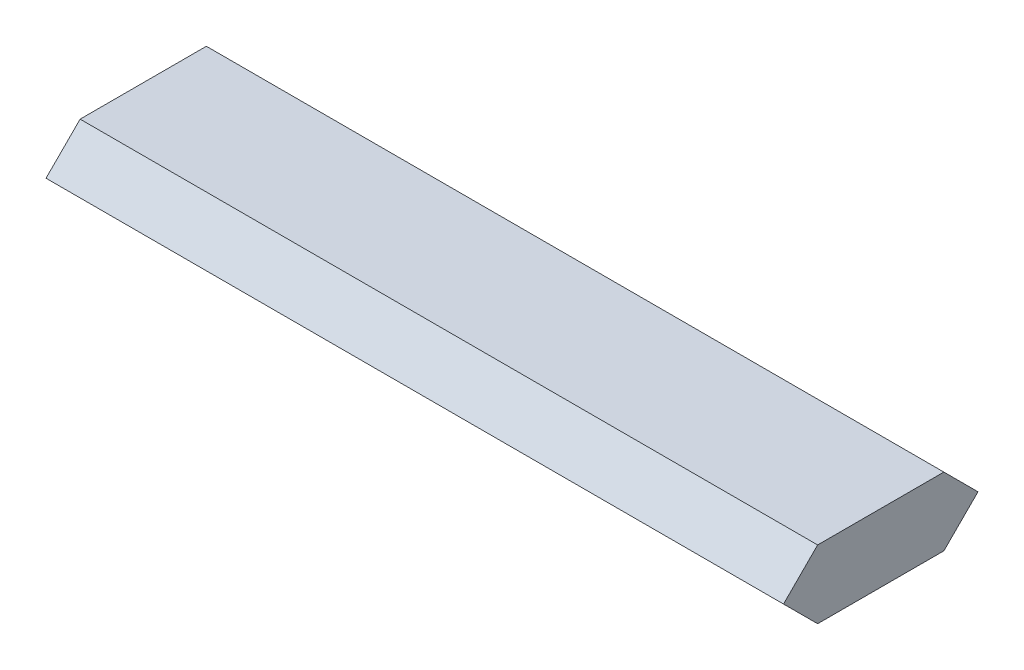
ISO-10303-21;
HEADER;
FILE_DESCRIPTION(('STEP AP214'),'2;1');
FILE_NAME('part.step','',(''),(''),'','','');
FILE_SCHEMA(('AUTOMOTIVE_DESIGN { 1 0 10303 214 1 1 1 1 }'));
ENDSEC;
DATA;
#1=APPLICATION_CONTEXT('core data for automotive mechanical design processes');
#2=APPLICATION_PROTOCOL_DEFINITION('international standard','automotive_design',2000,#1);
#3=PRODUCT_CONTEXT('',#1,'mechanical');
#4=PRODUCT('Part','Part','',(#3));
#5=PRODUCT_RELATED_PRODUCT_CATEGORY('part','',(#4));
#6=PRODUCT_DEFINITION_FORMATION('','',#4);
#7=PRODUCT_DEFINITION_CONTEXT('part definition',#1,'design');
#8=PRODUCT_DEFINITION('design','',#6,#7);
#9=PRODUCT_DEFINITION_SHAPE('','',#8);
#10=(LENGTH_UNIT() NAMED_UNIT(*) SI_UNIT(.MILLI.,.METRE.));
#11=(NAMED_UNIT(*) PLANE_ANGLE_UNIT() SI_UNIT($,.RADIAN.));
#12=(NAMED_UNIT(*) SI_UNIT($,.STERADIAN.) SOLID_ANGLE_UNIT());
#13=UNCERTAINTY_MEASURE_WITH_UNIT(LENGTH_MEASURE(1.E-05),#10,'distance_accuracy_value','');
#14=(GEOMETRIC_REPRESENTATION_CONTEXT(3) GLOBAL_UNCERTAINTY_ASSIGNED_CONTEXT((#13)) GLOBAL_UNIT_ASSIGNED_CONTEXT((#10,
#11,#12)) REPRESENTATION_CONTEXT('',''));
#15=CARTESIAN_POINT('',(0.,0.,0.));
#16=DIRECTION('',(0.,0.,1.));
#17=DIRECTION('',(1.,0.,0.));
#18=AXIS2_PLACEMENT_3D('',#15,#16,#17);
#19=CARTESIAN_POINT('',(15.875,2.93779359501496,2.71726649999997));
#20=DIRECTION('',(0.,-1.,0.));
#21=DIRECTION('',(0.,0.,-1.));
#22=AXIS2_PLACEMENT_3D('',#19,#20,#21);
#23=PLANE('',#22);
#24=DIRECTION('',(0.,0.,1.));
#25=VECTOR('',#24,1.);
#26=CARTESIAN_POINT('',(-15.875,2.93779359501496,2.71726649999997));
#27=LINE('',#26,#25);
#28=CARTESIAN_POINT('',(-15.875,2.93779359501496,-2.71726650000003));
#29=VERTEX_POINT('',#28);
#30=CARTESIAN_POINT('',(-15.875,2.93779359501496,2.71726649999997));
#31=VERTEX_POINT('',#30);
#32=EDGE_CURVE('E117',#29,#31,#27,.T.);
#33=ORIENTED_EDGE('',*,*,#32,.T.);
#34=DIRECTION('',(-1.,0.,0.));
#35=VECTOR('',#34,1.);
#36=CARTESIAN_POINT('',(15.875,2.93779359501496,2.71726649999997));
#37=LINE('',#36,#35);
#38=CARTESIAN_POINT('',(15.875,2.93779359501496,2.71726649999997));
#39=VERTEX_POINT('',#38);
#40=EDGE_CURVE('E11',#39,#31,#37,.T.);
#41=ORIENTED_EDGE('',*,*,#40,.F.);
#42=DIRECTION('',(0.,0.,1.));
#43=VECTOR('',#42,1.);
#44=CARTESIAN_POINT('',(15.875,2.93779359501496,2.71726649999997));
#45=LINE('',#44,#43);
#46=CARTESIAN_POINT('',(15.875,2.93779359501496,-2.71726650000003));
#47=VERTEX_POINT('',#46);
#48=EDGE_CURVE('E127',#47,#39,#45,.T.);
#49=ORIENTED_EDGE('',*,*,#48,.F.);
#50=DIRECTION('',(-1.,0.,0.));
#51=VECTOR('',#50,1.);
#52=CARTESIAN_POINT('',(15.875,2.93779359501496,-2.71726650000003));
#53=LINE('',#52,#51);
#54=EDGE_CURVE('E113',#47,#29,#53,.T.);
#55=ORIENTED_EDGE('',*,*,#54,.T.);
#56=EDGE_LOOP('',(#33,#41,#49,#55));
#57=FACE_BOUND('',#56,.T.);
#58=ADVANCED_FACE('F33',(#57),#23,.F.);
#59=CARTESIAN_POINT('',(15.875,2.93779359501496,2.71726649999997));
#60=DIRECTION('',(0.,-0.707106781186548,-0.707106781186548));
#61=DIRECTION('',(0.,0.707106781186548,-0.707106781186548));
#62=AXIS2_PLACEMENT_3D('',#59,#60,#61);
#63=PLANE('',#62);
#64=DIRECTION('',(0.,-0.707106781186548,0.707106781186548));
#65=VECTOR('',#64,1.);
#66=CARTESIAN_POINT('',(-15.875,2.93779359501496,2.71726649999997));
#67=LINE('',#66,#65);
#68=CARTESIAN_POINT('',(-15.875,1.46889679750747,4.18616329750747));
#69=VERTEX_POINT('',#68);
#70=EDGE_CURVE('E120',#31,#69,#67,.T.);
#71=ORIENTED_EDGE('',*,*,#70,.T.);
#72=DIRECTION('',(-1.,0.,0.));
#73=VECTOR('',#72,1.);
#74=CARTESIAN_POINT('',(15.875,1.46889679750747,4.18616329750747));
#75=LINE('',#74,#73);
#76=CARTESIAN_POINT('',(15.875,1.46889679750747,4.18616329750747));
#77=VERTEX_POINT('',#76);
#78=EDGE_CURVE('E41',#77,#69,#75,.T.);
#79=ORIENTED_EDGE('',*,*,#78,.F.);
#80=DIRECTION('',(0.,-0.707106781186548,0.707106781186548));
#81=VECTOR('',#80,1.);
#82=CARTESIAN_POINT('',(15.875,2.93779359501496,2.71726649999997));
#83=LINE('',#82,#81);
#84=EDGE_CURVE('E86',#39,#77,#83,.T.);
#85=ORIENTED_EDGE('',*,*,#84,.F.);
#86=ORIENTED_EDGE('',*,*,#40,.T.);
#87=EDGE_LOOP('',(#71,#79,#85,#86));
#88=FACE_BOUND('',#87,.T.);
#89=ADVANCED_FACE('F151',(#88),#63,.F.);
#90=CARTESIAN_POINT('',(15.875,0.,2.7172665));
#91=DIRECTION('',(0.,0.707106781186547,-0.707106781186548));
#92=DIRECTION('',(0.,0.707106781186548,0.707106781186547));
#93=AXIS2_PLACEMENT_3D('',#90,#91,#92);
#94=PLANE('',#93);
#95=DIRECTION('',(0.,-0.707106781186548,-0.707106781186547));
#96=VECTOR('',#95,1.);
#97=CARTESIAN_POINT('',(-15.875,0.,2.7172665));
#98=LINE('',#97,#96);
#99=CARTESIAN_POINT('',(-15.875,0.,2.7172665));
#100=VERTEX_POINT('',#99);
#101=EDGE_CURVE('E122',#69,#100,#98,.T.);
#102=ORIENTED_EDGE('',*,*,#101,.T.);
#103=DIRECTION('',(-1.,0.,0.));
#104=VECTOR('',#103,1.);
#105=CARTESIAN_POINT('',(15.875,0.,2.7172665));
#106=LINE('',#105,#104);
#107=CARTESIAN_POINT('',(15.875,0.,2.7172665));
#108=VERTEX_POINT('',#107);
#109=EDGE_CURVE('E108',#108,#100,#106,.T.);
#110=ORIENTED_EDGE('',*,*,#109,.F.);
#111=DIRECTION('',(0.,-0.707106781186548,-0.707106781186547));
#112=VECTOR('',#111,1.);
#113=CARTESIAN_POINT('',(15.875,0.,2.7172665));
#114=LINE('',#113,#112);
#115=EDGE_CURVE('E99',#77,#108,#114,.T.);
#116=ORIENTED_EDGE('',*,*,#115,.F.);
#117=ORIENTED_EDGE('',*,*,#78,.T.);
#118=EDGE_LOOP('',(#102,#110,#116,#117));
#119=FACE_BOUND('',#118,.T.);
#120=ADVANCED_FACE('F133',(#119),#94,.F.);
#121=CARTESIAN_POINT('',(15.875,0.,2.7172665));
#122=DIRECTION('',(0.,1.,0.));
#123=DIRECTION('',(0.,0.,1.));
#124=AXIS2_PLACEMENT_3D('',#121,#122,#123);
#125=PLANE('',#124);
#126=DIRECTION('',(0.,0.,-1.));
#127=VECTOR('',#126,1.);
#128=CARTESIAN_POINT('',(-15.875,0.,2.7172665));
#129=LINE('',#128,#127);
#130=CARTESIAN_POINT('',(-15.875,0.,-2.7172665));
#131=VERTEX_POINT('',#130);
#132=EDGE_CURVE('E107',#100,#131,#129,.T.);
#133=ORIENTED_EDGE('',*,*,#132,.T.);
#134=DIRECTION('',(-1.,0.,0.));
#135=VECTOR('',#134,1.);
#136=CARTESIAN_POINT('',(15.875,0.,-2.7172665));
#137=LINE('',#136,#135);
#138=CARTESIAN_POINT('',(15.875,0.,-2.7172665));
#139=VERTEX_POINT('',#138);
#140=EDGE_CURVE('E104',#139,#131,#137,.T.);
#141=ORIENTED_EDGE('',*,*,#140,.F.);
#142=DIRECTION('',(0.,0.,-1.));
#143=VECTOR('',#142,1.);
#144=CARTESIAN_POINT('',(15.875,0.,2.7172665));
#145=LINE('',#144,#143);
#146=EDGE_CURVE('E93',#108,#139,#145,.T.);
#147=ORIENTED_EDGE('',*,*,#146,.F.);
#148=ORIENTED_EDGE('',*,*,#109,.T.);
#149=EDGE_LOOP('',(#133,#141,#147,#148));
#150=FACE_BOUND('',#149,.T.);
#151=ADVANCED_FACE('F105',(#150),#125,.F.);
#152=CARTESIAN_POINT('',(15.875,0.,-2.7172665));
#153=DIRECTION('',(0.,0.707106781186548,0.707106781186547));
#154=DIRECTION('',(0.,-0.707106781186547,0.707106781186548));
#155=AXIS2_PLACEMENT_3D('',#152,#153,#154);
#156=PLANE('',#155);
#157=DIRECTION('',(0.,0.707106781186547,-0.707106781186548));
#158=VECTOR('',#157,1.);
#159=CARTESIAN_POINT('',(-15.875,0.,-2.7172665));
#160=LINE('',#159,#158);
#161=CARTESIAN_POINT('',(-15.875,1.46889679750749,-4.18616329750749));
#162=VERTEX_POINT('',#161);
#163=EDGE_CURVE('E72',#131,#162,#160,.T.);
#164=ORIENTED_EDGE('',*,*,#163,.T.);
#165=DIRECTION('',(-1.,0.,0.));
#166=VECTOR('',#165,1.);
#167=CARTESIAN_POINT('',(15.875,1.46889679750749,-4.18616329750749));
#168=LINE('',#167,#166);
#169=CARTESIAN_POINT('',(15.875,1.46889679750749,-4.18616329750749));
#170=VERTEX_POINT('',#169);
#171=EDGE_CURVE('E109',#170,#162,#168,.T.);
#172=ORIENTED_EDGE('',*,*,#171,.F.);
#173=DIRECTION('',(0.,0.707106781186547,-0.707106781186548));
#174=VECTOR('',#173,1.);
#175=CARTESIAN_POINT('',(15.875,0.,-2.7172665));
#176=LINE('',#175,#174);
#177=EDGE_CURVE('E97',#139,#170,#176,.T.);
#178=ORIENTED_EDGE('',*,*,#177,.F.);
#179=ORIENTED_EDGE('',*,*,#140,.T.);
#180=EDGE_LOOP('',(#164,#172,#178,#179));
#181=FACE_BOUND('',#180,.T.);
#182=ADVANCED_FACE('F111',(#181),#156,.F.);
#183=CARTESIAN_POINT('',(15.875,2.93779359501496,-2.71726650000003));
#184=DIRECTION('',(0.,-0.707106781186548,0.707106781186548));
#185=DIRECTION('',(0.,-0.707106781186548,-0.707106781186548));
#186=AXIS2_PLACEMENT_3D('',#183,#184,#185);
#187=PLANE('',#186);
#188=DIRECTION('',(0.,0.707106781186548,0.707106781186548));
#189=VECTOR('',#188,1.);
#190=CARTESIAN_POINT('',(-15.875,2.93779359501496,-2.71726650000003));
#191=LINE('',#190,#189);
#192=EDGE_CURVE('E78',#162,#29,#191,.T.);
#193=ORIENTED_EDGE('',*,*,#192,.T.);
#194=ORIENTED_EDGE('',*,*,#54,.F.);
#195=DIRECTION('',(0.,0.707106781186548,0.707106781186548));
#196=VECTOR('',#195,1.);
#197=CARTESIAN_POINT('',(15.875,2.93779359501496,-2.71726650000003));
#198=LINE('',#197,#196);
#199=EDGE_CURVE('E49',#170,#47,#198,.T.);
#200=ORIENTED_EDGE('',*,*,#199,.F.);
#201=ORIENTED_EDGE('',*,*,#171,.T.);
#202=EDGE_LOOP('',(#193,#194,#200,#201));
#203=FACE_BOUND('',#202,.T.);
#204=ADVANCED_FACE('F140',(#203),#187,.F.);
#205=CARTESIAN_POINT('',(15.875,0.,0.));
#206=DIRECTION('',(-1.,0.,0.));
#207=DIRECTION('',(0.,0.,1.));
#208=AXIS2_PLACEMENT_3D('',#205,#206,#207);
#209=PLANE('',#208);
#210=ORIENTED_EDGE('',*,*,#48,.T.);
#211=ORIENTED_EDGE('',*,*,#84,.T.);
#212=ORIENTED_EDGE('',*,*,#115,.T.);
#213=ORIENTED_EDGE('',*,*,#146,.T.);
#214=ORIENTED_EDGE('',*,*,#177,.T.);
#215=ORIENTED_EDGE('',*,*,#199,.T.);
#216=EDGE_LOOP('',(#210,#211,#212,#213,#214,#215));
#217=FACE_BOUND('',#216,.T.);
#218=ADVANCED_FACE('F95',(#217),#209,.F.);
#219=CARTESIAN_POINT('',(-15.875,0.,0.));
#220=DIRECTION('',(-1.,0.,0.));
#221=DIRECTION('',(0.,0.,1.));
#222=AXIS2_PLACEMENT_3D('',#219,#220,#221);
#223=PLANE('',#222);
#224=ORIENTED_EDGE('',*,*,#32,.F.);
#225=ORIENTED_EDGE('',*,*,#192,.F.);
#226=ORIENTED_EDGE('',*,*,#163,.F.);
#227=ORIENTED_EDGE('',*,*,#132,.F.);
#228=ORIENTED_EDGE('',*,*,#101,.F.);
#229=ORIENTED_EDGE('',*,*,#70,.F.);
#230=EDGE_LOOP('',(#224,#225,#226,#227,#228,#229));
#231=FACE_BOUND('',#230,.T.);
#232=ADVANCED_FACE('F136',(#231),#223,.T.);
#233=CLOSED_SHELL('',(#58,#89,#120,#151,#182,#204,#218,#232));
#234=MANIFOLD_SOLID_BREP('B2',#233);
#235=ADVANCED_BREP_SHAPE_REPRESENTATION('',(#18,#234),#14);
#236=SHAPE_DEFINITION_REPRESENTATION(#9,#235);
ENDSEC;
END-ISO-10303-21;
